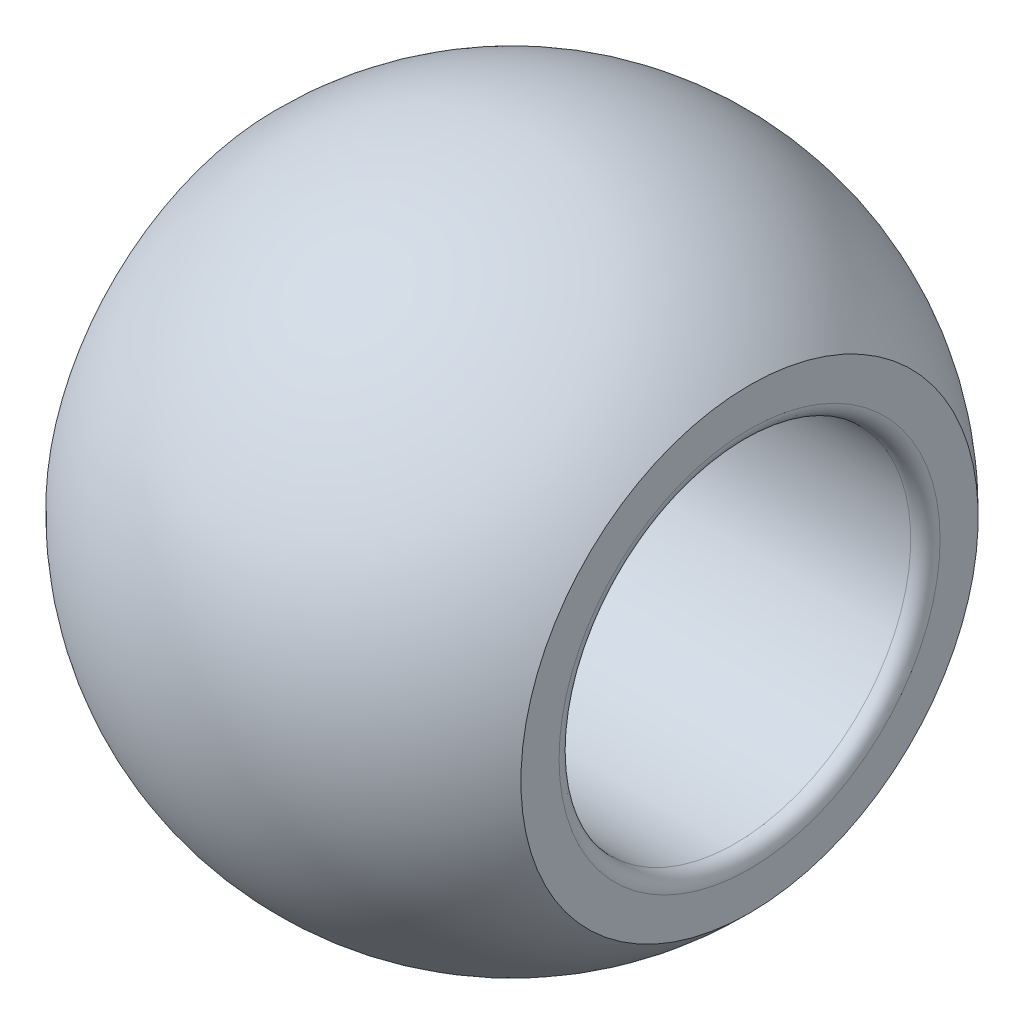
ISO-10303-21;
HEADER;
FILE_DESCRIPTION(('STEP AP214'),'2;1');
FILE_NAME('part.step','',(''),(''),'','','');
FILE_SCHEMA(('AUTOMOTIVE_DESIGN { 1 0 10303 214 1 1 1 1 }'));
ENDSEC;
DATA;
#1=APPLICATION_CONTEXT('core data for automotive mechanical design processes');
#2=APPLICATION_PROTOCOL_DEFINITION('international standard','automotive_design',2000,#1);
#3=PRODUCT_CONTEXT('',#1,'mechanical');
#4=PRODUCT('Part','Part','',(#3));
#5=PRODUCT_RELATED_PRODUCT_CATEGORY('part','',(#4));
#6=PRODUCT_DEFINITION_FORMATION('','',#4);
#7=PRODUCT_DEFINITION_CONTEXT('part definition',#1,'design');
#8=PRODUCT_DEFINITION('design','',#6,#7);
#9=PRODUCT_DEFINITION_SHAPE('','',#8);
#10=(LENGTH_UNIT() NAMED_UNIT(*) SI_UNIT(.MILLI.,.METRE.));
#11=(NAMED_UNIT(*) PLANE_ANGLE_UNIT() SI_UNIT($,.RADIAN.));
#12=(NAMED_UNIT(*) SI_UNIT($,.STERADIAN.) SOLID_ANGLE_UNIT());
#13=UNCERTAINTY_MEASURE_WITH_UNIT(LENGTH_MEASURE(1.E-05),#10,'distance_accuracy_value','');
#14=(GEOMETRIC_REPRESENTATION_CONTEXT(3) GLOBAL_UNCERTAINTY_ASSIGNED_CONTEXT((#13)) GLOBAL_UNIT_ASSIGNED_CONTEXT((#10,
#11,#12)) REPRESENTATION_CONTEXT('',''));
#15=CARTESIAN_POINT('',(0.,0.,0.));
#16=DIRECTION('',(0.,0.,1.));
#17=DIRECTION('',(1.,0.,0.));
#18=AXIS2_PLACEMENT_3D('',#15,#16,#17);
#19=CARTESIAN_POINT('',(0.,0.,0.));
#20=DIRECTION('',(-1.,0.,0.));
#21=DIRECTION('',(0.,1.,0.));
#22=AXIS2_PLACEMENT_3D('',#19,#20,#21);
#23=SPHERICAL_SURFACE('',#22,11.25);
#24=CARTESIAN_POINT('',(-8.10547710029715,0.,0.));
#25=DIRECTION('',(-1.,0.,0.));
#26=DIRECTION('',(0.,0.,1.));
#27=AXIS2_PLACEMENT_3D('',#24,#25,#26);
#28=CIRCLE('',#27,7.80152170903591);
#29=CARTESIAN_POINT('',(-8.10547710029715,7.80152170903591,0.));
#30=VERTEX_POINT('',#29);
#31=EDGE_CURVE('E10',#30,#30,#28,.T.);
#32=CARTESIAN_POINT('',(8.10547710029708,0.,0.));
#33=DIRECTION('',(-1.,0.,0.));
#34=DIRECTION('',(0.,0.,1.));
#35=AXIS2_PLACEMENT_3D('',#32,#33,#34);
#36=CIRCLE('',#35,7.80152170903597);
#37=CARTESIAN_POINT('',(8.10547710029708,7.80152170903597,0.));
#38=VERTEX_POINT('',#37);
#39=EDGE_CURVE('E53',#38,#38,#36,.T.);
#40=CARTESIAN_POINT('',(-8.10547710029715,7.80152170903591,0.));
#41=CARTESIAN_POINT('',(-7.97472262810508,7.93737670991986,0.));
#42=CARTESIAN_POINT('',(-7.84054691348871,8.0699382449386,0.));
#43=CARTESIAN_POINT('',(-7.56570509380978,8.32815307959095,0.));
#44=CARTESIAN_POINT('',(-7.42503898874721,8.45380637922458,0.));
#45=CARTESIAN_POINT('',(-7.13756848257825,8.69788343945206,0.));
#46=CARTESIAN_POINT('',(-6.99076408147186,8.81630720004592,0.));
#47=CARTESIAN_POINT('',(-6.69138898927797,9.04562683153563,0.));
#48=CARTESIAN_POINT('',(-6.53881829819046,9.15652270243149,0.));
#49=CARTESIAN_POINT('',(-6.2282960296537,9.37050597838391,0.));
#50=CARTESIAN_POINT('',(-6.07034445220444,9.47359338344048,0.));
#51=CARTESIAN_POINT('',(-5.74945973142769,9.67169922494219,0.));
#52=CARTESIAN_POINT('',(-5.58652658810019,9.76671766138734,0.));
#53=CARTESIAN_POINT('',(-5.25609056337348,9.94844536879247,0.));
#54=CARTESIAN_POINT('',(-5.08858768197427,10.0351546397525,0.));
#55=CARTESIAN_POINT('',(-4.74943558248549,10.200044846488,0.));
#56=CARTESIAN_POINT('',(-4.57778636439591,10.2782257822636,0.));
#57=CARTESIAN_POINT('',(-4.23077546752039,10.425861699519,0.));
#58=CARTESIAN_POINT('',(-4.05541378873444,10.4953166809987,0.));
#59=CARTESIAN_POINT('',(-3.70142123206421,10.6253251288543,0.));
#60=CARTESIAN_POINT('',(-3.52279035417992,10.6858785952301,0.));
#61=CARTESIAN_POINT('',(-3.16271092402108,10.7979309519422,0.));
#62=CARTESIAN_POINT('',(-2.98126237174653,10.8494298422784,0.));
#63=CARTESIAN_POINT('',(-2.61600623986017,10.9432428733277,0.));
#64=CARTESIAN_POINT('',(-2.43219866024837,10.9855570140409,0.));
#65=CARTESIAN_POINT('',(-2.06268908361644,11.060893588495,0.));
#66=CARTESIAN_POINT('',(-1.87698708659631,11.0939160222359,0.));
#67=CARTESIAN_POINT('',(-1.50415807359893,11.1505857120284,0.));
#68=CARTESIAN_POINT('',(-1.31703105762167,11.1742329680801,0.));
#69=CARTESIAN_POINT('',(-0.941825007175671,11.2120925293866,0.));
#70=CARTESIAN_POINT('',(-0.753745972706924,11.2263048346416,0.));
#71=CARTESIAN_POINT('',(-0.3771112921588,11.2452585699483,0.));
#72=CARTESIAN_POINT('',(-0.188555646079422,11.25,0.));
#73=CARTESIAN_POINT('',(0.188555646079332,11.25,0.));
#74=CARTESIAN_POINT('',(0.37711129215871,11.2452585699483,0.));
#75=CARTESIAN_POINT('',(0.753745972706834,11.2263048346416,0.));
#76=CARTESIAN_POINT('',(0.941825007175582,11.2120925293866,0.));
#77=CARTESIAN_POINT('',(1.31703105762158,11.1742329680801,0.));
#78=CARTESIAN_POINT('',(1.50415807359884,11.1505857120284,0.));
#79=CARTESIAN_POINT('',(1.87698708659622,11.0939160222359,0.));
#80=CARTESIAN_POINT('',(2.06268908361635,11.060893588495,0.));
#81=CARTESIAN_POINT('',(2.43219866024828,10.9855570140409,0.));
#82=CARTESIAN_POINT('',(2.61600623986009,10.9432428733277,0.));
#83=CARTESIAN_POINT('',(2.98126237174644,10.8494298422784,0.));
#84=CARTESIAN_POINT('',(3.162710924021,10.7979309519422,0.));
#85=CARTESIAN_POINT('',(3.52279035417984,10.6858785952302,0.));
#86=CARTESIAN_POINT('',(3.70142123206413,10.6253251288543,0.));
#87=CARTESIAN_POINT('',(4.05541378873436,10.4953166809987,0.));
#88=CARTESIAN_POINT('',(4.23077546752031,10.425861699519,0.));
#89=CARTESIAN_POINT('',(4.57778636439583,10.2782257822637,0.));
#90=CARTESIAN_POINT('',(4.74943558248541,10.2000448464881,0.));
#91=CARTESIAN_POINT('',(5.08858768197419,10.0351546397525,0.));
#92=CARTESIAN_POINT('',(5.25609056337341,9.94844536879252,0.));
#93=CARTESIAN_POINT('',(5.58652658810012,9.76671766138738,0.));
#94=CARTESIAN_POINT('',(5.74945973142761,9.67169922494224,0.));
#95=CARTESIAN_POINT('',(6.07034445220437,9.47359338344053,0.));
#96=CARTESIAN_POINT('',(6.22829602965362,9.37050597838396,0.));
#97=CARTESIAN_POINT('',(6.53881829819038,9.15652270243154,0.));
#98=CARTESIAN_POINT('',(6.69138898927789,9.04562683153568,0.));
#99=CARTESIAN_POINT('',(6.99076408147179,8.81630720004597,0.));
#100=CARTESIAN_POINT('',(7.13756848257818,8.69788343945212,0.));
#101=CARTESIAN_POINT('',(7.42503898874714,8.45380637922464,0.));
#102=CARTESIAN_POINT('',(7.56570509380971,8.32815307959101,0.));
#103=CARTESIAN_POINT('',(7.84054691348865,8.06993824493866,0.));
#104=CARTESIAN_POINT('',(7.97472262810501,7.93737670991993,0.));
#105=CARTESIAN_POINT('',(8.10547710029708,7.80152170903597,0.));
#106=B_SPLINE_CURVE_WITH_KNOTS('',3,(#40,#41,#42,#43,#44,#45,#46,#47,#48,#49,#50,#51,#52,#53,
#54,#55,#56,#57,#58,#59,#60,#61,#62,#63,#64,#65,#66,#67,#68,#69,#70,#71,#72,#73,#74,#75,#76,#77,
#78,#79,#80,#81,#82,#83,#84,#85,#86,#87,#88,#89,#90,#91,#92,#93,#94,#95,#96,#97,#98,#99,#100,
#101,#102,#103,#104,#105),.UNSPECIFIED.,.F.,.F.,(4,2,2,2,2,2,2,2,2,2,2,2,2,2,2,2,2,2,2,2,2,2,2,
2,2,2,2,2,2,2,2,2,4),(0.,0.565607371207692,1.13121474241538,1.69682211362308,2.26242948483077,
2.82803685603846,3.39364422724615,3.95925159845385,4.52485896966154,5.09046634086923,
5.65607371207692,6.22168108328461,6.7872884544923,7.3528958257,7.91850319690769,
8.48411056811538,9.04971793932307,9.61532531053076,10.1809326817385,10.7465400529461,
11.3121474241538,11.8777547953615,12.4433621665692,13.0089695377769,13.5745769089846,
14.1401842801923,14.7057916514,15.2713990226077,15.8370063938154,16.4026137650231,
16.9682211362308,17.5338285074384,18.0994358786461),.UNSPECIFIED.);
#107=EDGE_CURVE('BSEAM31',#30,#38,#106,.T.);
#108=ORIENTED_EDGE('',*,*,#31,.F.);
#109=ORIENTED_EDGE('',*,*,#39,.T.);
#110=ORIENTED_EDGE('',*,*,#107,.T.);
#111=ORIENTED_EDGE('',*,*,#107,.F.);
#112=EDGE_LOOP('',(#108,#110,#109,#111));
#113=FACE_BOUND('',#112,.T.);
#114=ADVANCED_FACE('F31',(#113),#23,.T.);
#115=CARTESIAN_POINT('',(-8.10547710029715,7.80152170903591,0.));
#116=DIRECTION('',(1.,0.,0.));
#117=DIRECTION('',(0.,0.,-1.));
#118=AXIS2_PLACEMENT_3D('',#115,#116,#117);
#119=PLANE('',#118);
#120=CARTESIAN_POINT('',(-8.10547710029715,0.,0.));
#121=DIRECTION('',(-1.,0.,0.));
#122=DIRECTION('',(0.,0.,1.));
#123=AXIS2_PLACEMENT_3D('',#120,#121,#122);
#124=CIRCLE('',#123,6.49999999999997);
#125=CARTESIAN_POINT('',(-8.10547710029715,0.,6.49999999999997));
#126=VERTEX_POINT('',#125);
#127=EDGE_CURVE('E37',#126,#126,#124,.T.);
#128=ORIENTED_EDGE('',*,*,#127,.F.);
#129=EDGE_LOOP('',(#128));
#130=FACE_BOUND('',#129,.T.);
#131=ORIENTED_EDGE('',*,*,#31,.T.);
#132=EDGE_LOOP('',(#131));
#133=FACE_BOUND('',#132,.T.);
#134=ADVANCED_FACE('F78',(#130,#133),#119,.F.);
#135=CARTESIAN_POINT('',(-7.60547710029717,0.,0.));
#136=DIRECTION('',(-1.,0.,0.));
#137=DIRECTION('',(0.,0.,1.));
#138=AXIS2_PLACEMENT_3D('',#135,#136,#137);
#139=TOROIDAL_SURFACE('',#138,6.49999999999997,0.499999999999978);
#140=CARTESIAN_POINT('',(-7.60547710029717,0.,0.));
#141=DIRECTION('',(-1.,0.,0.));
#142=DIRECTION('',(0.,0.,1.));
#143=AXIS2_PLACEMENT_3D('',#140,#141,#142);
#144=CIRCLE('',#143,5.99999999999999);
#145=CARTESIAN_POINT('',(-7.60547710029717,0.,5.99999999999999));
#146=VERTEX_POINT('',#145);
#147=EDGE_CURVE('E41',#146,#146,#144,.T.);
#148=ORIENTED_EDGE('',*,*,#147,.F.);
#149=EDGE_LOOP('',(#148));
#150=FACE_BOUND('',#149,.T.);
#151=ORIENTED_EDGE('',*,*,#127,.T.);
#152=EDGE_LOOP('',(#151));
#153=FACE_BOUND('',#152,.T.);
#154=ADVANCED_FACE('F73',(#150,#153),#139,.T.);
#155=CARTESIAN_POINT('',(-8.00000000000009,0.,0.));
#156=DIRECTION('',(-1.,0.,0.));
#157=DIRECTION('',(0.,0.,1.));
#158=AXIS2_PLACEMENT_3D('',#155,#156,#157);
#159=CYLINDRICAL_SURFACE('',#158,5.99999999999999);
#160=CARTESIAN_POINT('',(7.6054771002971,0.,0.));
#161=DIRECTION('',(-1.,0.,0.));
#162=DIRECTION('',(0.,0.,1.));
#163=AXIS2_PLACEMENT_3D('',#160,#161,#162);
#164=CIRCLE('',#163,6.);
#165=CARTESIAN_POINT('',(7.6054771002971,0.,6.));
#166=VERTEX_POINT('',#165);
#167=EDGE_CURVE('E45',#166,#166,#164,.T.);
#168=ORIENTED_EDGE('',*,*,#167,.F.);
#169=EDGE_LOOP('',(#168));
#170=FACE_BOUND('',#169,.T.);
#171=ORIENTED_EDGE('',*,*,#147,.T.);
#172=EDGE_LOOP('',(#171));
#173=FACE_BOUND('',#172,.T.);
#174=ADVANCED_FACE('F67',(#170,#173),#159,.F.);
#175=CARTESIAN_POINT('',(7.6054771002971,0.,0.));
#176=DIRECTION('',(-1.,0.,0.));
#177=DIRECTION('',(0.,0.,1.));
#178=AXIS2_PLACEMENT_3D('',#175,#176,#177);
#179=TOROIDAL_SURFACE('',#178,6.49999999999997,0.499999999999978);
#180=CARTESIAN_POINT('',(8.10547710029708,0.,0.));
#181=DIRECTION('',(-1.,0.,0.));
#182=DIRECTION('',(0.,0.,1.));
#183=AXIS2_PLACEMENT_3D('',#180,#181,#182);
#184=CIRCLE('',#183,6.49999999999997);
#185=CARTESIAN_POINT('',(8.10547710029708,0.,6.49999999999997));
#186=VERTEX_POINT('',#185);
#187=EDGE_CURVE('E50',#186,#186,#184,.T.);
#188=ORIENTED_EDGE('',*,*,#187,.F.);
#189=EDGE_LOOP('',(#188));
#190=FACE_BOUND('',#189,.T.);
#191=ORIENTED_EDGE('',*,*,#167,.T.);
#192=EDGE_LOOP('',(#191));
#193=FACE_BOUND('',#192,.T.);
#194=ADVANCED_FACE('F61',(#190,#193),#179,.T.);
#195=CARTESIAN_POINT('',(8.10547710029708,6.49999999999997,0.));
#196=DIRECTION('',(-1.,0.,0.));
#197=DIRECTION('',(0.,0.,1.));
#198=AXIS2_PLACEMENT_3D('',#195,#196,#197);
#199=PLANE('',#198);
#200=ORIENTED_EDGE('',*,*,#39,.F.);
#201=EDGE_LOOP('',(#200));
#202=FACE_BOUND('',#201,.T.);
#203=ORIENTED_EDGE('',*,*,#187,.T.);
#204=EDGE_LOOP('',(#203));
#205=FACE_BOUND('',#204,.T.);
#206=ADVANCED_FACE('F58',(#202,#205),#199,.F.);
#207=CLOSED_SHELL('',(#114,#134,#154,#174,#194,#206));
#208=MANIFOLD_SOLID_BREP('B2',#207);
#209=ADVANCED_BREP_SHAPE_REPRESENTATION('',(#18,#208),#14);
#210=SHAPE_DEFINITION_REPRESENTATION(#9,#209);
ENDSEC;
END-ISO-10303-21;
